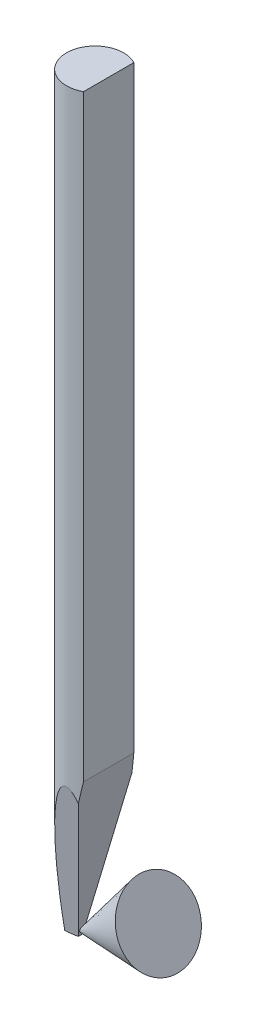
ISO-10303-21;
HEADER;
FILE_DESCRIPTION(('STEP AP214'),'2;1');
FILE_NAME('part.step','',(''),(''),'','','');
FILE_SCHEMA(('AUTOMOTIVE_DESIGN { 1 0 10303 214 1 1 1 1 }'));
ENDSEC;
DATA;
#1=APPLICATION_CONTEXT('core data for automotive mechanical design processes');
#2=APPLICATION_PROTOCOL_DEFINITION('international standard','automotive_design',2000,#1);
#3=PRODUCT_CONTEXT('',#1,'mechanical');
#4=PRODUCT('Part','Part','',(#3));
#5=PRODUCT_RELATED_PRODUCT_CATEGORY('part','',(#4));
#6=PRODUCT_DEFINITION_FORMATION('','',#4);
#7=PRODUCT_DEFINITION_CONTEXT('part definition',#1,'design');
#8=PRODUCT_DEFINITION('design','',#6,#7);
#9=PRODUCT_DEFINITION_SHAPE('','',#8);
#10=(LENGTH_UNIT() NAMED_UNIT(*) SI_UNIT(.MILLI.,.METRE.));
#11=(NAMED_UNIT(*) PLANE_ANGLE_UNIT() SI_UNIT($,.RADIAN.));
#12=(NAMED_UNIT(*) SI_UNIT($,.STERADIAN.) SOLID_ANGLE_UNIT());
#13=UNCERTAINTY_MEASURE_WITH_UNIT(LENGTH_MEASURE(1.E-05),#10,'distance_accuracy_value','');
#14=(GEOMETRIC_REPRESENTATION_CONTEXT(3) GLOBAL_UNCERTAINTY_ASSIGNED_CONTEXT((#13)) GLOBAL_UNIT_ASSIGNED_CONTEXT((#10,
#11,#12)) REPRESENTATION_CONTEXT('',''));
#15=CARTESIAN_POINT('',(0.,0.,0.));
#16=DIRECTION('',(0.,0.,1.));
#17=DIRECTION('',(1.,0.,0.));
#18=AXIS2_PLACEMENT_3D('',#15,#16,#17);
#19=CARTESIAN_POINT('',(-0.621405053817371,0.09398,0.));
#20=DIRECTION('',(-0.500000000000004,-0.866025403784436,0.));
#21=DIRECTION('',(0.866025403784436,-0.500000000000004,0.));
#22=AXIS2_PLACEMENT_3D('',#19,#20,#21);
#23=CYLINDRICAL_SURFACE('',#22,0.028575);
#24=DIRECTION('',(-0.500000000000004,-0.866025403784436,0.));
#25=VECTOR('',#24,1.);
#26=CARTESIAN_POINT('',(-0.506748324086857,0.292571281322942,0.028575));
#27=LINE('',#26,#25);
#28=CARTESIAN_POINT('',(-0.621405053817371,0.09398,0.028575));
#29=VERTEX_POINT('',#28);
#30=CARTESIAN_POINT('',(-0.675664432115813,0.,0.028575));
#31=VERTEX_POINT('',#30);
#32=EDGE_CURVE('E182',#29,#31,#27,.T.);
#33=ORIENTED_EDGE('',*,*,#32,.F.);
#34=CARTESIAN_POINT('',(-0.621405053817371,0.09398,0.));
#35=DIRECTION('',(0.,-1.,0.));
#36=DIRECTION('',(-1.,0.,0.));
#37=AXIS2_PLACEMENT_3D('',#34,#35,#36);
#38=ELLIPSE('',#37,0.0329955678841872,0.028575);
#39=CARTESIAN_POINT('',(-0.621405053817371,0.09398,-0.028575));
#40=VERTEX_POINT('',#39);
#41=EDGE_CURVE('E62',#40,#29,#38,.F.);
#42=ORIENTED_EDGE('',*,*,#41,.F.);
#43=DIRECTION('',(0.500000000000004,0.866025403784436,0.));
#44=VECTOR('',#43,1.);
#45=CARTESIAN_POINT('',(-0.621405053817371,0.09398,-0.028575));
#46=LINE('',#45,#44);
#47=CARTESIAN_POINT('',(-0.675664432115813,0.,-0.028575));
#48=VERTEX_POINT('',#47);
#49=EDGE_CURVE('E185',#48,#40,#46,.T.);
#50=ORIENTED_EDGE('',*,*,#49,.F.);
#51=CARTESIAN_POINT('',(-0.675664432115813,0.,0.));
#52=DIRECTION('',(0.,1.,0.));
#53=DIRECTION('',(-1.,0.,0.));
#54=AXIS2_PLACEMENT_3D('',#51,#52,#53);
#55=ELLIPSE('',#54,0.0329955678841872,0.028575);
#56=EDGE_CURVE('E12',#31,#48,#55,.F.);
#57=ORIENTED_EDGE('',*,*,#56,.F.);
#58=EDGE_LOOP('',(#33,#42,#50,#57));
#59=FACE_BOUND('',#58,.T.);
#60=ADVANCED_FACE('F54',(#59),#23,.T.);
#61=CARTESIAN_POINT('',(-0.51816,0.09398,0.028575));
#62=DIRECTION('',(-1.,0.,0.));
#63=DIRECTION('',(0.,0.,1.));
#64=AXIS2_PLACEMENT_3D('',#61,#62,#63);
#65=PLANE('',#64);
#66=DIRECTION('',(0.,1.,0.));
#67=VECTOR('',#66,1.);
#68=CARTESIAN_POINT('',(-0.51816,0.09398,-0.028575));
#69=LINE('',#68,#67);
#70=CARTESIAN_POINT('',(-0.51816,0.,-0.028575));
#71=VERTEX_POINT('',#70);
#72=CARTESIAN_POINT('',(-0.51816,0.0779995171120104,-0.028575));
#73=VERTEX_POINT('',#72);
#74=EDGE_CURVE('E199',#71,#73,#69,.T.);
#75=ORIENTED_EDGE('',*,*,#74,.T.);
#76=CARTESIAN_POINT('',(-0.51816,0.0939800000000001,0.));
#77=DIRECTION('',(1.,0.,0.));
#78=DIRECTION('',(0.,1.,0.));
#79=AXIS2_PLACEMENT_3D('',#76,#77,#78);
#80=ELLIPSE('',#79,0.0366617420935411,0.03175);
#81=CARTESIAN_POINT('',(-0.51816,0.0779995171120104,0.028575));
#82=VERTEX_POINT('',#81);
#83=EDGE_CURVE('E136',#73,#82,#80,.F.);
#84=ORIENTED_EDGE('',*,*,#83,.T.);
#85=DIRECTION('',(0.,1.,0.));
#86=VECTOR('',#85,1.);
#87=CARTESIAN_POINT('',(-0.51816,0.09398,0.028575));
#88=LINE('',#87,#86);
#89=CARTESIAN_POINT('',(-0.51816,0.,0.028575));
#90=VERTEX_POINT('',#89);
#91=EDGE_CURVE('E142',#90,#82,#88,.T.);
#92=ORIENTED_EDGE('',*,*,#91,.F.);
#93=DIRECTION('',(0.,0.,-1.));
#94=VECTOR('',#93,1.);
#95=CARTESIAN_POINT('',(-0.51816,0.,0.028575));
#96=LINE('',#95,#94);
#97=EDGE_CURVE('E186',#90,#71,#96,.T.);
#98=ORIENTED_EDGE('',*,*,#97,.T.);
#99=EDGE_LOOP('',(#75,#84,#92,#98));
#100=FACE_BOUND('',#99,.T.);
#101=ADVANCED_FACE('F175',(#100),#65,.F.);
#102=CARTESIAN_POINT('',(-0.654400621701558,0.09398,0.028575));
#103=DIRECTION('',(0.,-1.,0.));
#104=DIRECTION('',(1.,0.,0.));
#105=AXIS2_PLACEMENT_3D('',#102,#103,#104);
#106=PLANE('',#105);
#107=DIRECTION('',(-1.,0.,0.));
#108=VECTOR('',#107,1.);
#109=CARTESIAN_POINT('',(-0.654400621701558,0.09398,-0.028575));
#110=LINE('',#109,#108);
#111=CARTESIAN_POINT('',(-0.545839008291484,0.09398,-0.028575));
#112=VERTEX_POINT('',#111);
#113=EDGE_CURVE('E202',#112,#40,#110,.T.);
#114=ORIENTED_EDGE('',*,*,#113,.T.);
#115=ORIENTED_EDGE('',*,*,#41,.T.);
#116=DIRECTION('',(-1.,0.,0.));
#117=VECTOR('',#116,1.);
#118=CARTESIAN_POINT('',(-0.654400621701558,0.09398,0.028575));
#119=LINE('',#118,#117);
#120=CARTESIAN_POINT('',(-0.545839008291484,0.09398,0.028575));
#121=VERTEX_POINT('',#120);
#122=EDGE_CURVE('E189',#121,#29,#119,.T.);
#123=ORIENTED_EDGE('',*,*,#122,.F.);
#124=CARTESIAN_POINT('',(-0.51816,0.09398,0.));
#125=DIRECTION('',(0.,1.,0.));
#126=DIRECTION('',(1.,0.,0.));
#127=AXIS2_PLACEMENT_3D('',#124,#125,#126);
#128=ELLIPSE('',#127,0.0635000000000006,0.03175);
#129=EDGE_CURVE('E119',#121,#112,#128,.F.);
#130=ORIENTED_EDGE('',*,*,#129,.T.);
#131=EDGE_LOOP('',(#114,#115,#123,#130));
#132=FACE_BOUND('',#131,.T.);
#133=ADVANCED_FACE('F179',(#132),#106,.F.);
#134=CARTESIAN_POINT('',(-0.51816,0.,0.028575));
#135=DIRECTION('',(0.,1.,0.));
#136=DIRECTION('',(-1.,0.,0.));
#137=AXIS2_PLACEMENT_3D('',#134,#135,#136);
#138=PLANE('',#137);
#139=DIRECTION('',(1.,0.,0.));
#140=VECTOR('',#139,1.);
#141=CARTESIAN_POINT('',(-0.51816,0.,0.028575));
#142=LINE('',#141,#140);
#143=EDGE_CURVE('E194',#31,#90,#142,.T.);
#144=ORIENTED_EDGE('',*,*,#143,.F.);
#145=ORIENTED_EDGE('',*,*,#56,.T.);
#146=DIRECTION('',(1.,0.,0.));
#147=VECTOR('',#146,1.);
#148=CARTESIAN_POINT('',(-0.51816,0.,-0.028575));
#149=LINE('',#148,#147);
#150=EDGE_CURVE('E196',#48,#71,#149,.T.);
#151=ORIENTED_EDGE('',*,*,#150,.T.);
#152=ORIENTED_EDGE('',*,*,#97,.F.);
#153=EDGE_LOOP('',(#144,#145,#151,#152));
#154=FACE_BOUND('',#153,.T.);
#155=ADVANCED_FACE('F214',(#154),#138,.F.);
#156=CARTESIAN_POINT('',(0.,0.,0.028575));
#157=DIRECTION('',(0.,0.,-1.));
#158=DIRECTION('',(-1.,0.,0.));
#159=AXIS2_PLACEMENT_3D('',#156,#157,#158);
#160=PLANE('',#159);
#161=ORIENTED_EDGE('',*,*,#122,.T.);
#162=ORIENTED_EDGE('',*,*,#32,.T.);
#163=ORIENTED_EDGE('',*,*,#143,.T.);
#164=ORIENTED_EDGE('',*,*,#91,.T.);
#165=CARTESIAN_POINT('',(-0.51816,0.09398,0.0285749999999994));
#166=VERTEX_POINT('',#165);
#167=EDGE_CURVE('E137',#82,#166,#88,.T.);
#168=ORIENTED_EDGE('',*,*,#167,.T.);
#169=EDGE_CURVE('E191',#166,#121,#119,.T.);
#170=ORIENTED_EDGE('',*,*,#169,.T.);
#171=EDGE_LOOP('',(#161,#162,#163,#164,#168,#170));
#172=FACE_BOUND('',#171,.T.);
#173=ADVANCED_FACE('F190',(#172),#160,.F.);
#174=CARTESIAN_POINT('',(0.,0.,-0.028575));
#175=DIRECTION('',(0.,0.,-1.));
#176=DIRECTION('',(-1.,0.,0.));
#177=AXIS2_PLACEMENT_3D('',#174,#175,#176);
#178=PLANE('',#177);
#179=ORIENTED_EDGE('',*,*,#150,.F.);
#180=ORIENTED_EDGE('',*,*,#49,.T.);
#181=ORIENTED_EDGE('',*,*,#113,.F.);
#182=CARTESIAN_POINT('',(-0.51816,0.09398,-0.0285749999999994));
#183=VERTEX_POINT('',#182);
#184=EDGE_CURVE('E115',#183,#112,#110,.T.);
#185=ORIENTED_EDGE('',*,*,#184,.F.);
#186=EDGE_CURVE('E128',#73,#183,#69,.T.);
#187=ORIENTED_EDGE('',*,*,#186,.F.);
#188=ORIENTED_EDGE('',*,*,#74,.F.);
#189=EDGE_LOOP('',(#179,#180,#181,#185,#187,#188));
#190=FACE_BOUND('',#189,.T.);
#191=ADVANCED_FACE('F211',(#190),#178,.T.);
#192=CARTESIAN_POINT('',(-0.51816,0.09398,27.3516498663205));
#193=DIRECTION('',(1.,0.,0.));
#194=DIRECTION('',(0.,0.,-1.));
#195=AXIS2_PLACEMENT_3D('',#192,#193,#194);
#196=PLANE('',#195);
#197=CARTESIAN_POINT('',(-0.51816,0.09398,-0.0317500000000005));
#198=VERTEX_POINT('',#197);
#199=EDGE_CURVE('E126',#198,#73,#80,.F.);
#200=ORIENTED_EDGE('',*,*,#199,.T.);
#201=ORIENTED_EDGE('',*,*,#186,.T.);
#202=DIRECTION('',(0.,0.,-1.));
#203=VECTOR('',#202,1.);
#204=CARTESIAN_POINT('',(-0.51816,0.09398,27.3516498663205));
#205=LINE('',#204,#203);
#206=EDGE_CURVE('E113',#183,#198,#205,.T.);
#207=ORIENTED_EDGE('',*,*,#206,.T.);
#208=EDGE_LOOP('',(#200,#201,#207));
#209=FACE_BOUND('',#208,.T.);
#210=ADVANCED_FACE('F125',(#209),#196,.F.);
#211=CARTESIAN_POINT('',(-0.654400621701558,0.09398,27.3516498663205));
#212=DIRECTION('',(0.,1.,0.));
#213=DIRECTION('',(-1.,0.,0.));
#214=AXIS2_PLACEMENT_3D('',#211,#212,#213);
#215=PLANE('',#214);
#216=ORIENTED_EDGE('',*,*,#206,.F.);
#217=ORIENTED_EDGE('',*,*,#184,.T.);
#218=EDGE_CURVE('E110',#112,#198,#128,.F.);
#219=ORIENTED_EDGE('',*,*,#218,.T.);
#220=EDGE_LOOP('',(#216,#217,#219));
#221=FACE_BOUND('',#220,.T.);
#222=ADVANCED_FACE('F112',(#221),#215,.F.);
#223=CARTESIAN_POINT('',(-0.797595083895375,-0.0673519209080184,0.));
#224=DIRECTION('',(0.866025403784441,0.499999999999995,0.));
#225=DIRECTION('',(-0.499999999999995,0.866025403784441,0.));
#226=AXIS2_PLACEMENT_3D('',#223,#224,#225);
#227=CYLINDRICAL_SURFACE('',#226,0.03175);
#228=ORIENTED_EDGE('',*,*,#199,.F.);
#229=ORIENTED_EDGE('',*,*,#218,.F.);
#230=ORIENTED_EDGE('',*,*,#129,.F.);
#231=CARTESIAN_POINT('',(-0.51816,0.09398,0.0317500000000005));
#232=VERTEX_POINT('',#231);
#233=EDGE_CURVE('E122',#232,#121,#128,.F.);
#234=ORIENTED_EDGE('',*,*,#233,.F.);
#235=EDGE_CURVE('E139',#82,#232,#80,.F.);
#236=ORIENTED_EDGE('',*,*,#235,.F.);
#237=ORIENTED_EDGE('',*,*,#83,.F.);
#238=EDGE_LOOP('',(#228,#229,#230,#234,#236,#237));
#239=FACE_BOUND('',#238,.T.);
#240=CARTESIAN_POINT('',(-0.412227364748446,0.15514023547845,0.));
#241=DIRECTION('',(0.866025403784442,0.499999999999995,0.));
#242=DIRECTION('',(-0.499999999999995,0.866025403784442,0.));
#243=AXIS2_PLACEMENT_3D('',#240,#241,#242);
#244=CIRCLE('',#243,0.03175);
#245=CARTESIAN_POINT('',(-0.428102364748446,0.182636542048606,0.));
#246=VERTEX_POINT('',#245);
#247=EDGE_CURVE('E120',#246,#246,#244,.T.);
#248=ORIENTED_EDGE('',*,*,#247,.F.);
#249=EDGE_LOOP('',(#248));
#250=FACE_BOUND('',#249,.T.);
#251=ADVANCED_FACE('F132',(#239,#250),#227,.T.);
#252=ORIENTED_EDGE('',*,*,#167,.F.);
#253=ORIENTED_EDGE('',*,*,#235,.T.);
#254=EDGE_CURVE('E129',#232,#166,#205,.T.);
#255=ORIENTED_EDGE('',*,*,#254,.T.);
#256=EDGE_LOOP('',(#252,#253,#255));
#257=FACE_BOUND('',#256,.T.);
#258=ADVANCED_FACE('F165',(#257),#196,.F.);
#259=ORIENTED_EDGE('',*,*,#169,.F.);
#260=ORIENTED_EDGE('',*,*,#254,.F.);
#261=ORIENTED_EDGE('',*,*,#233,.T.);
#262=EDGE_LOOP('',(#259,#260,#261));
#263=FACE_BOUND('',#262,.T.);
#264=ADVANCED_FACE('F161',(#263),#215,.F.);
#265=CARTESIAN_POINT('',(-0.412227364748446,0.15514023547845,0.));
#266=DIRECTION('',(0.866025403784442,0.499999999999995,0.));
#267=DIRECTION('',(-0.499999999999995,0.866025403784442,0.));
#268=AXIS2_PLACEMENT_3D('',#265,#266,#267);
#269=CONICAL_SURFACE('',#268,0.03175,0.392699081698725);
#270=CARTESIAN_POINT('',(1.75283181458564,1.40513773547844,0.));
#271=DIRECTION('',(0.866025403784442,0.499999999999995,0.));
#272=DIRECTION('',(-0.499999999999995,0.866025403784442,0.));
#273=AXIS2_PLACEMENT_3D('',#270,#271,#272);
#274=CIRCLE('',#273,1.06728183486493);
#275=CARTESIAN_POINT('',(1.21919089715318,2.32943091746914,0.));
#276=VERTEX_POINT('',#275);
#277=EDGE_CURVE('E130',#276,#276,#274,.T.);
#278=CARTESIAN_POINT('',(1.21919089715318,2.32943091746914,0.));
#279=CARTESIAN_POINT('',(1.2020315923417,2.30706847605851,0.));
#280=CARTESIAN_POINT('',(1.18487228753023,2.28470603464788,0.));
#281=CARTESIAN_POINT('',(1.15055367790728,2.23998115182662,0.));
#282=CARTESIAN_POINT('',(1.1333943730958,2.21761871041599,0.));
#283=CARTESIAN_POINT('',(1.09907576347285,2.17289382759472,0.));
#284=CARTESIAN_POINT('',(1.08191645866138,2.15053138618409,0.));
#285=CARTESIAN_POINT('',(1.04759784903843,2.10580650336283,0.));
#286=CARTESIAN_POINT('',(1.03043854422695,2.0834440619522,0.));
#287=CARTESIAN_POINT('',(0.996119934604002,2.03871917913094,0.));
#288=CARTESIAN_POINT('',(0.978960629792527,2.01635673772031,0.));
#289=CARTESIAN_POINT('',(0.944642020169576,1.97163185489905,0.));
#290=CARTESIAN_POINT('',(0.927482715358101,1.94926941348842,0.));
#291=CARTESIAN_POINT('',(0.89316410573515,1.90454453066716,0.));
#292=CARTESIAN_POINT('',(0.876004800923675,1.88218208925653,0.));
#293=CARTESIAN_POINT('',(0.841686191300724,1.83745720643527,0.));
#294=CARTESIAN_POINT('',(0.824526886489249,1.81509476502464,0.));
#295=CARTESIAN_POINT('',(0.790208276866299,1.77036988220337,0.));
#296=CARTESIAN_POINT('',(0.773048972054823,1.74800744079274,0.));
#297=CARTESIAN_POINT('',(0.738730362431873,1.70328255797148,0.));
#298=CARTESIAN_POINT('',(0.721571057620398,1.68092011656085,0.));
#299=CARTESIAN_POINT('',(0.687252447997447,1.63619523373959,0.));
#300=CARTESIAN_POINT('',(0.670093143185972,1.61383279232896,0.));
#301=CARTESIAN_POINT('',(0.635774533563021,1.5691079095077,0.));
#302=CARTESIAN_POINT('',(0.618615228751546,1.54674546809707,0.));
#303=CARTESIAN_POINT('',(0.584296619128595,1.50202058527581,0.));
#304=CARTESIAN_POINT('',(0.56713731431712,1.47965814386518,0.));
#305=CARTESIAN_POINT('',(0.532818704694169,1.43493326104392,0.));
#306=CARTESIAN_POINT('',(0.515659399882694,1.41257081963329,0.));
#307=CARTESIAN_POINT('',(0.481340790259744,1.36784593681203,0.));
#308=CARTESIAN_POINT('',(0.464181485448268,1.34548349540139,0.));
#309=CARTESIAN_POINT('',(0.429862875825318,1.30075861258013,0.));
#310=CARTESIAN_POINT('',(0.412703571013842,1.2783961711695,0.));
#311=CARTESIAN_POINT('',(0.378384961390892,1.23367128834824,0.));
#312=CARTESIAN_POINT('',(0.361225656579417,1.21130884693761,0.));
#313=CARTESIAN_POINT('',(0.326907046956466,1.16658396411635,0.));
#314=CARTESIAN_POINT('',(0.309747742144991,1.14422152270572,0.));
#315=CARTESIAN_POINT('',(0.27542913252204,1.09949663988446,0.));
#316=CARTESIAN_POINT('',(0.258269827710565,1.07713419847383,0.));
#317=CARTESIAN_POINT('',(0.223951218087615,1.03240931565257,0.));
#318=CARTESIAN_POINT('',(0.206791913276139,1.01004687424194,0.));
#319=CARTESIAN_POINT('',(0.172473303653189,0.965321991420675,0.));
#320=CARTESIAN_POINT('',(0.155313998841713,0.942959550010045,0.));
#321=CARTESIAN_POINT('',(0.120995389218763,0.898234667188783,0.));
#322=CARTESIAN_POINT('',(0.103836084407288,0.875872225778153,0.));
#323=CARTESIAN_POINT('',(0.069517474784337,0.831147342956892,0.));
#324=CARTESIAN_POINT('',(0.0523581699728618,0.808784901546261,0.));
#325=CARTESIAN_POINT('',(0.0180395603499112,0.764060018725,0.));
#326=CARTESIAN_POINT('',(0.000880255538435967,0.74169757731437,0.));
#327=CARTESIAN_POINT('',(-0.0334383540845146,0.696972694493109,0.));
#328=CARTESIAN_POINT('',(-0.0505976588959899,0.674610253082478,0.));
#329=CARTESIAN_POINT('',(-0.0849162685189404,0.629885370261217,0.));
#330=CARTESIAN_POINT('',(-0.102075573330416,0.607522928850586,0.));
#331=CARTESIAN_POINT('',(-0.136394182953366,0.562798046029325,0.));
#332=CARTESIAN_POINT('',(-0.153553487764842,0.540435604618695,0.));
#333=CARTESIAN_POINT('',(-0.187872097387792,0.495710721797434,0.));
#334=CARTESIAN_POINT('',(-0.205031402199267,0.473348280386803,0.));
#335=CARTESIAN_POINT('',(-0.239350011822218,0.428623397565542,0.));
#336=CARTESIAN_POINT('',(-0.256509316633693,0.406260956154912,0.));
#337=CARTESIAN_POINT('',(-0.290827926256644,0.361536073333651,0.));
#338=CARTESIAN_POINT('',(-0.307987231068119,0.33917363192302,0.));
#339=CARTESIAN_POINT('',(-0.34230584069107,0.294448749101759,0.));
#340=CARTESIAN_POINT('',(-0.359465145502545,0.272086307691129,0.));
#341=CARTESIAN_POINT('',(-0.393783755125495,0.227361424869868,0.));
#342=CARTESIAN_POINT('',(-0.410943059936971,0.204998983459237,0.));
#343=CARTESIAN_POINT('',(-0.428102364748446,0.182636542048606,0.));
#344=B_SPLINE_CURVE_WITH_KNOTS('',3,(#278,#279,#280,#281,#282,#283,#284,#285,#286,#287,#288,
#289,#290,#291,#292,#293,#294,#295,#296,#297,#298,#299,#300,#301,#302,#303,#304,#305,#306,#307,
#308,#309,#310,#311,#312,#313,#314,#315,#316,#317,#318,#319,#320,#321,#322,#323,#324,#325,#326,
#327,#328,#329,#330,#331,#332,#333,#334,#335,#336,#337,#338,#339,#340,#341,#342,#343),
.UNSPECIFIED.,.F.,.F.,(4,2,2,2,2,2,2,2,2,2,2,2,2,2,2,2,2,2,2,2,2,2,2,2,2,2,2,2,2,2,2,2,4),(0.,
0.0845617215240619,0.169123443048124,0.253685164572186,0.338246886096248,0.42280860762031,
0.507370329144372,0.591932050668434,0.676493772192496,0.761055493716558,0.845617215240621,
0.930178936764682,1.01474065828874,1.09930237981281,1.18386410133687,1.26842582286093,
1.35298754438499,1.43754926590905,1.52211098743312,1.60667270895718,1.69123443048124,
1.7757961520053,1.86035787352936,1.94491959505343,2.02948131657749,2.11404303810155,
2.19860475962561,2.28316648114968,2.36772820267374,2.4522899241978,2.53685164572186,
2.62141336724592,2.70597508876999),.UNSPECIFIED.);
#345=EDGE_CURVE('BSEAM158',#276,#246,#344,.T.);
#346=ORIENTED_EDGE('',*,*,#277,.F.);
#347=ORIENTED_EDGE('',*,*,#247,.T.);
#348=ORIENTED_EDGE('',*,*,#345,.T.);
#349=ORIENTED_EDGE('',*,*,#345,.F.);
#350=EDGE_LOOP('',(#346,#348,#347,#349));
#351=FACE_BOUND('',#350,.T.);
#352=ADVANCED_FACE('F158',(#351),#269,.T.);
#353=CARTESIAN_POINT('',(1.75283181458564,1.40513773547844,0.));
#354=DIRECTION('',(0.866025403784442,0.499999999999995,0.));
#355=DIRECTION('',(-0.499999999999995,0.866025403784442,0.));
#356=AXIS2_PLACEMENT_3D('',#353,#354,#355);
#357=PLANE('',#356);
#358=ORIENTED_EDGE('',*,*,#277,.T.);
#359=EDGE_LOOP('',(#358));
#360=FACE_BOUND('',#359,.T.);
#361=ADVANCED_FACE('F156',(#360),#357,.T.);
#362=CLOSED_SHELL('',(#60,#101,#133,#155,#173,#191,#210,#222,#251,#258,#264,#352,#361));
#363=MANIFOLD_SOLID_BREP('B2',#362);
#364=CARTESIAN_POINT('',(0.,21.0312,0.));
#365=DIRECTION('',(0.,-1.,0.));
#366=DIRECTION('',(0.,0.,-1.));
#367=AXIS2_PLACEMENT_3D('',#364,#365,#366);
#368=CYLINDRICAL_SURFACE('',#367,0.792479999999998);
#369=CARTESIAN_POINT('',(0.,-0.288101116436578,0.));
#370=DIRECTION('',(0.,-0.173648177666931,-0.984807753012208));
#371=DIRECTION('',(0.,-0.984807753012208,0.173648177666931));
#372=AXIS2_PLACEMENT_3D('',#369,#370,#371);
#373=ELLIPSE('',#372,4.56371043248163,0.792479999999998);
#374=CARTESIAN_POINT('',(-0.790850118796222,0.,-0.0507920612593778));
#375=VERTEX_POINT('',#374);
#376=CARTESIAN_POINT('',(0.279336812010102,3.91781682663915,-0.741616812010104));
#377=VERTEX_POINT('',#376);
#378=EDGE_CURVE('E420',#375,#377,#373,.T.);
#379=ORIENTED_EDGE('',*,*,#378,.F.);
#380=CARTESIAN_POINT('',(-0.790851138521022,0.,0.0507841225187556));
#381=CARTESIAN_POINT('',(-0.791832373230439,0.0125989339100728,0.0355035476341237));
#382=CARTESIAN_POINT('',(-0.792479999999998,0.0241300000000007,0.017964652679665));
#383=CARTESIAN_POINT('',(-0.792479999999998,0.0241300000000007,-0.0179646526796647));
#384=CARTESIAN_POINT('',(-0.791832373230439,0.0125989339100697,-0.0355035476341192));
#385=CARTESIAN_POINT('',(-0.790851138521022,0.,-0.0507841225187557));
#386=(BOUNDED_CURVE() B_SPLINE_CURVE(3,(#380,#381,#382,#383,#384,#385),.UNSPECIFIED.,.F.,
.F.) B_SPLINE_CURVE_WITH_KNOTS((4,2,4),(0.,5.07841225187557E-05,0.000101568245037511),
.UNSPECIFIED.) CURVE() GEOMETRIC_REPRESENTATION_ITEM() RATIONAL_B_SPLINE_CURVE((1.,1.,1.,1.,1.,1.)) REPRESENTATION_ITEM(''));
#387=CARTESIAN_POINT('',(-0.790850118796222,0.,0.0507920612593778));
#388=VERTEX_POINT('',#387);
#389=EDGE_CURVE('E355',#375,#388,#386,.F.);
#390=ORIENTED_EDGE('',*,*,#389,.T.);
#391=CARTESIAN_POINT('',(0.,-0.288101116436578,0.));
#392=DIRECTION('',(0.,-0.173648177666931,0.984807753012208));
#393=DIRECTION('',(0.,-0.984807753012208,-0.173648177666931));
#394=AXIS2_PLACEMENT_3D('',#391,#392,#393);
#395=ELLIPSE('',#394,4.56371043248163,0.792479999999998);
#396=CARTESIAN_POINT('',(0.279336812010102,3.91781682663915,0.741616812010104));
#397=VERTEX_POINT('',#396);
#398=EDGE_CURVE('E424',#397,#388,#395,.T.);
#399=ORIENTED_EDGE('',*,*,#398,.F.);
#400=CARTESIAN_POINT('',(0.,2.33361904313629,0.));
#401=DIRECTION('',(-0.984807753012208,0.173648177666931,0.));
#402=DIRECTION('',(-0.173648177666931,-0.984807753012208,0.));
#403=AXIS2_PLACEMENT_3D('',#400,#401,#402);
#404=ELLIPSE('',#403,4.56371043248164,0.792479999999998);
#405=CARTESIAN_POINT('',(0.37592,4.46556730476697,0.69764511322018));
#406=VERTEX_POINT('',#405);
#407=EDGE_CURVE('E362',#397,#406,#404,.T.);
#408=ORIENTED_EDGE('',*,*,#407,.T.);
#409=DIRECTION('',(0.,-1.,0.));
#410=VECTOR('',#409,1.);
#411=CARTESIAN_POINT('',(0.37592,21.0312,0.69764511322018));
#412=LINE('',#411,#410);
#413=CARTESIAN_POINT('',(0.37592,21.0312,0.69764511322018));
#414=VERTEX_POINT('',#413);
#415=EDGE_CURVE('E482',#414,#406,#412,.T.);
#416=ORIENTED_EDGE('',*,*,#415,.F.);
#417=CARTESIAN_POINT('',(0.,21.0312,0.));
#418=DIRECTION('',(0.,1.,0.));
#419=DIRECTION('',(0.,0.,1.));
#420=AXIS2_PLACEMENT_3D('',#417,#418,#419);
#421=CIRCLE('',#420,0.792479999999998);
#422=CARTESIAN_POINT('',(0.37592,21.0312,-0.69764511322018));
#423=VERTEX_POINT('',#422);
#424=EDGE_CURVE('E484',#423,#414,#421,.T.);
#425=ORIENTED_EDGE('',*,*,#424,.F.);
#426=DIRECTION('',(0.,-1.,0.));
#427=VECTOR('',#426,1.);
#428=CARTESIAN_POINT('',(0.37592,21.0312,-0.69764511322018));
#429=LINE('',#428,#427);
#430=CARTESIAN_POINT('',(0.37592,4.46556730476697,-0.69764511322018));
#431=VERTEX_POINT('',#430);
#432=EDGE_CURVE('E480',#431,#423,#429,.F.);
#433=ORIENTED_EDGE('',*,*,#432,.F.);
#434=EDGE_CURVE('E429',#431,#377,#404,.T.);
#435=ORIENTED_EDGE('',*,*,#434,.T.);
#436=EDGE_LOOP('',(#379,#390,#399,#408,#416,#425,#433,#435));
#437=FACE_BOUND('',#436,.T.);
#438=ADVANCED_FACE('F341',(#437),#368,.T.);
#439=CARTESIAN_POINT('',(0.37592,21.0312,0.80247998));
#440=DIRECTION('',(1.,0.,0.));
#441=DIRECTION('',(0.,0.,-1.));
#442=AXIS2_PLACEMENT_3D('',#439,#440,#441);
#443=PLANE('',#442);
#444=DIRECTION('',(0.,0.,1.));
#445=VECTOR('',#444,1.);
#446=CARTESIAN_POINT('',(0.37592,4.46556730476697,0.80247998));
#447=LINE('',#446,#445);
#448=EDGE_CURVE('E369',#431,#406,#447,.T.);
#449=ORIENTED_EDGE('',*,*,#448,.F.);
#450=ORIENTED_EDGE('',*,*,#432,.T.);
#451=DIRECTION('',(0.,0.,1.));
#452=VECTOR('',#451,1.);
#453=CARTESIAN_POINT('',(0.37592,21.0312,0.80247998));
#454=LINE('',#453,#452);
#455=EDGE_CURVE('E431',#423,#414,#454,.T.);
#456=ORIENTED_EDGE('',*,*,#455,.T.);
#457=ORIENTED_EDGE('',*,*,#415,.T.);
#458=EDGE_LOOP('',(#449,#450,#456,#457));
#459=FACE_BOUND('',#458,.T.);
#460=ADVANCED_FACE('F521',(#459),#443,.T.);
#461=CARTESIAN_POINT('',(0.,21.0312,0.));
#462=DIRECTION('',(0.,1.,0.));
#463=DIRECTION('',(0.,0.,1.));
#464=AXIS2_PLACEMENT_3D('',#461,#462,#463);
#465=PLANE('',#464);
#466=ORIENTED_EDGE('',*,*,#424,.T.);
#467=ORIENTED_EDGE('',*,*,#455,.F.);
#468=EDGE_LOOP('',(#466,#467));
#469=FACE_BOUND('',#468,.T.);
#470=ADVANCED_FACE('F516',(#469),#465,.T.);
#471=CARTESIAN_POINT('',(26.8738719491216,0.,0.0508));
#472=DIRECTION('',(0.,-0.173648177666931,0.984807753012208));
#473=DIRECTION('',(0.,-0.984807753012208,-0.173648177666931));
#474=AXIS2_PLACEMENT_3D('',#471,#472,#473);
#475=PLANE('',#474);
#476=DIRECTION('',(-0.984346441568213,-0.173566836012845,-0.0306045161452665));
#477=VECTOR('',#476,1.);
#478=CARTESIAN_POINT('',(26.0178900300477,4.70813316624208,0.880970905976857));
#479=LINE('',#478,#477);
#480=CARTESIAN_POINT('',(-0.402758882498248,0.0494599151344352,0.059521117501752));
#481=VERTEX_POINT('',#480);
#482=CARTESIAN_POINT('',(-0.683260000000002,0.,0.0507920612593779));
#483=VERTEX_POINT('',#482);
#484=EDGE_CURVE('E478',#481,#483,#479,.T.);
#485=ORIENTED_EDGE('',*,*,#484,.F.);
#486=DIRECTION('',(-0.171087869746036,-0.970287525247814,-0.171087869746036));
#487=VECTOR('',#486,1.);
#488=CARTESIAN_POINT('',(0.387191151492609,4.52948918131316,0.849471151492611));
#489=LINE('',#488,#487);
#490=EDGE_CURVE('E475',#397,#481,#489,.T.);
#491=ORIENTED_EDGE('',*,*,#490,.F.);
#492=ORIENTED_EDGE('',*,*,#398,.T.);
#493=CARTESIAN_POINT('',(-0.683260000000002,0.,0.0507841225187557));
#494=DIRECTION('',(-1.,0.,0.));
#495=VECTOR('',#494,1.);
#496=LINE('',#493,#495);
#497=EDGE_CURVE('E407',#483,#388,#496,.T.);
#498=ORIENTED_EDGE('',*,*,#497,.F.);
#499=EDGE_LOOP('',(#485,#491,#492,#498));
#500=FACE_BOUND('',#499,.T.);
#501=ADVANCED_FACE('F508',(#500),#475,.T.);
#502=CARTESIAN_POINT('',(26.8738719491216,0.,-0.0508));
#503=DIRECTION('',(0.,-0.173648177666931,-0.984807753012208));
#504=DIRECTION('',(0.,0.984807753012208,-0.173648177666931));
#505=AXIS2_PLACEMENT_3D('',#502,#503,#504);
#506=PLANE('',#505);
#507=DIRECTION('',(0.984346441568213,0.173566836012845,-0.0306045161452665));
#508=VECTOR('',#507,1.);
#509=CARTESIAN_POINT('',(26.0178900300477,4.70813316624208,-0.880970905976857));
#510=LINE('',#509,#508);
#511=CARTESIAN_POINT('',(-0.683260000000002,0.,-0.0507920612593778));
#512=VERTEX_POINT('',#511);
#513=CARTESIAN_POINT('',(-0.402758882498248,0.0494599151344352,-0.059521117501752));
#514=VERTEX_POINT('',#513);
#515=EDGE_CURVE('E423',#512,#514,#510,.T.);
#516=ORIENTED_EDGE('',*,*,#515,.F.);
#517=CARTESIAN_POINT('',(-0.683260000000002,0.,-0.0508));
#518=DIRECTION('',(-1.,0.,0.));
#519=VECTOR('',#518,1.);
#520=LINE('',#517,#519);
#521=EDGE_CURVE('E403',#512,#375,#520,.T.);
#522=ORIENTED_EDGE('',*,*,#521,.T.);
#523=ORIENTED_EDGE('',*,*,#378,.T.);
#524=DIRECTION('',(0.171087869746036,0.970287525247814,-0.171087869746036));
#525=VECTOR('',#524,1.);
#526=CARTESIAN_POINT('',(0.387191151492609,4.52948918131316,-0.849471151492611));
#527=LINE('',#526,#525);
#528=EDGE_CURVE('E486',#514,#377,#527,.T.);
#529=ORIENTED_EDGE('',*,*,#528,.F.);
#530=EDGE_LOOP('',(#516,#522,#523,#529));
#531=FACE_BOUND('',#530,.T.);
#532=ADVANCED_FACE('F419',(#531),#506,.T.);
#533=CARTESIAN_POINT('',(-0.68326,0.,26.4674719491216));
#534=DIRECTION('',(-0.173648177666931,0.984807753012208,0.));
#535=DIRECTION('',(-0.984807753012208,-0.173648177666931,0.));
#536=AXIS2_PLACEMENT_3D('',#533,#534,#535);
#537=PLANE('',#536);
#538=ORIENTED_EDGE('',*,*,#484,.T.);
#539=CARTESIAN_POINT('',(-2.59192989639233,-0.33655,0.));
#540=DIRECTION('',(-0.173648177666931,0.984807753012208,0.));
#541=DIRECTION('',(-0.984807753012208,-0.173648177666931,0.));
#542=AXIS2_PLACEMENT_3D('',#539,#540,#541);
#543=ELLIPSE('',#542,1.96005512164276,0.34036);
#544=EDGE_CURVE('E434',#483,#512,#543,.T.);
#545=ORIENTED_EDGE('',*,*,#544,.T.);
#546=ORIENTED_EDGE('',*,*,#515,.T.);
#547=DIRECTION('',(0.,0.,-1.));
#548=VECTOR('',#547,1.);
#549=CARTESIAN_POINT('',(-0.402758882498248,0.0494599151344345,26.4674719491216));
#550=LINE('',#549,#548);
#551=EDGE_CURVE('E470',#481,#514,#550,.T.);
#552=ORIENTED_EDGE('',*,*,#551,.F.);
#553=EDGE_LOOP('',(#538,#545,#546,#552));
#554=FACE_BOUND('',#553,.T.);
#555=ADVANCED_FACE('F517',(#554),#537,.F.);
#556=CARTESIAN_POINT('',(-0.402758882498248,0.0494599151344345,26.4674719491216));
#557=DIRECTION('',(-0.984807753012208,0.173648177666931,0.));
#558=DIRECTION('',(-0.173648177666931,-0.984807753012208,0.));
#559=AXIS2_PLACEMENT_3D('',#556,#557,#558);
#560=PLANE('',#559);
#561=ORIENTED_EDGE('',*,*,#407,.F.);
#562=ORIENTED_EDGE('',*,*,#490,.T.);
#563=ORIENTED_EDGE('',*,*,#551,.T.);
#564=ORIENTED_EDGE('',*,*,#528,.T.);
#565=ORIENTED_EDGE('',*,*,#434,.F.);
#566=ORIENTED_EDGE('',*,*,#448,.T.);
#567=EDGE_LOOP('',(#561,#562,#563,#564,#565,#566));
#568=FACE_BOUND('',#567,.T.);
#569=ADVANCED_FACE('F454',(#568),#560,.F.);
#570=CARTESIAN_POINT('',(27.2580469491216,-0.33655,0.));
#571=DIRECTION('',(-1.,0.,0.));
#572=DIRECTION('',(0.,0.,1.));
#573=AXIS2_PLACEMENT_3D('',#570,#571,#572);
#574=CYLINDRICAL_SURFACE('',#573,0.34036);
#575=ORIENTED_EDGE('',*,*,#497,.T.);
#576=CARTESIAN_POINT('',(-0.790851138521022,0.,-0.0507841225187557));
#577=CARTESIAN_POINT('',(-0.781672847989257,0.00265885189672187,-0.0331637214670044));
#578=CARTESIAN_POINT('',(-0.772159999999997,0.00380999999999996,-0.0165186674285798));
#579=CARTESIAN_POINT('',(-0.772159999999997,0.00380999999999998,0.0165186674285799));
#580=CARTESIAN_POINT('',(-0.781672847989255,0.00265885189672172,0.0331637214670053));
#581=CARTESIAN_POINT('',(-0.790851138521022,0.,0.0507841225187556));
#582=(BOUNDED_CURVE() B_SPLINE_CURVE(3,(#576,#577,#578,#579,#580,#581),.UNSPECIFIED.,.F.,
.F.) B_SPLINE_CURVE_WITH_KNOTS((4,2,4),(0.,5.07841225187557E-05,0.000101568245037511),
.UNSPECIFIED.) CURVE() GEOMETRIC_REPRESENTATION_ITEM() RATIONAL_B_SPLINE_CURVE((1.,1.,1.,1.,1.,1.)) REPRESENTATION_ITEM(''));
#583=EDGE_CURVE('E52',#388,#375,#582,.F.);
#584=ORIENTED_EDGE('',*,*,#583,.T.);
#585=ORIENTED_EDGE('',*,*,#521,.F.);
#586=ORIENTED_EDGE('',*,*,#544,.F.);
#587=EDGE_LOOP('',(#575,#584,#585,#586));
#588=FACE_BOUND('',#587,.T.);
#589=ADVANCED_FACE('F402',(#588),#574,.F.);
#590=CARTESIAN_POINT('',(-0.790851138521022,0.,-0.0507841225187557));
#591=CARTESIAN_POINT('',(-0.791832373230439,0.0125989339100697,-0.0355035476341192));
#592=CARTESIAN_POINT('',(-0.792479999999998,0.0241300000000007,-0.0179646526796647));
#593=CARTESIAN_POINT('',(-0.792479999999998,0.0241300000000007,0.017964652679665));
#594=CARTESIAN_POINT('',(-0.791832373230439,0.0125989339100728,0.0355035476341237));
#595=CARTESIAN_POINT('',(-0.790851138521022,0.,0.0507841225187556));
#596=CARTESIAN_POINT('',(-0.790851138521022,0.,-0.0507841225187557));
#597=CARTESIAN_POINT('',(-0.79193261126447,0.00254129614606856,-0.033942559517898));
#598=CARTESIAN_POINT('',(-0.792479999999999,0.00380999999999921,-0.0169790313800419));
#599=CARTESIAN_POINT('',(-0.792479999999999,0.00380999999999921,0.0169790313800421));
#600=CARTESIAN_POINT('',(-0.791932611264467,0.00254129614606956,0.0339425595178998));
#601=CARTESIAN_POINT('',(-0.790851138521022,0.,0.0507841225187556));
#602=CARTESIAN_POINT('',(-0.790851138521022,0.,-0.0507841225187557));
#603=CARTESIAN_POINT('',(-0.781672847989257,0.00265885189672187,-0.0331637214670044));
#604=CARTESIAN_POINT('',(-0.772159999999997,0.00380999999999996,-0.0165186674285798));
#605=CARTESIAN_POINT('',(-0.772159999999997,0.00380999999999998,0.0165186674285799));
#606=CARTESIAN_POINT('',(-0.781672847989255,0.00265885189672172,0.0331637214670053));
#607=CARTESIAN_POINT('',(-0.790851138521022,0.,0.0507841225187556));
#608=(BOUNDED_SURFACE() B_SPLINE_SURFACE(2,3,((#590,#591,#592,#593,#594,#595),(#596,#597,#598,
#599,#600,#601),(#602,#603,#604,#605,#606,#607)),.UNSPECIFIED.,.F.,.F.,
.F.) B_SPLINE_SURFACE_WITH_KNOTS((3,3),(4,2,4),(0.,1.),(0.,5.07841225187557E-05,
0.000101568245037511),
.UNSPECIFIED.) GEOMETRIC_REPRESENTATION_ITEM() RATIONAL_B_SPLINE_SURFACE(((1.,1.,1.,1.,1.,1.),
(0.703718137053402,0.705925465674569,0.70710678118652,0.707106781186524,0.70592546567461,
0.703718137053402),(1.,1.,1.,1.,1.,1.))) REPRESENTATION_ITEM('') SURFACE());
#609=ORIENTED_EDGE('',*,*,#389,.F.);
#610=ORIENTED_EDGE('',*,*,#583,.F.);
#611=EDGE_LOOP('',(#609,#610));
#612=FACE_BOUND('',#611,.T.);
#613=ADVANCED_FACE('F344',(#612),#608,.T.);
#614=CLOSED_SHELL('',(#438,#460,#470,#501,#532,#555,#569,#589,#613));
#615=MANIFOLD_SOLID_BREP('B6',#614);
#616=ADVANCED_BREP_SHAPE_REPRESENTATION('',(#18,#363,#615),#14);
#617=SHAPE_DEFINITION_REPRESENTATION(#9,#616);
ENDSEC;
END-ISO-10303-21;
